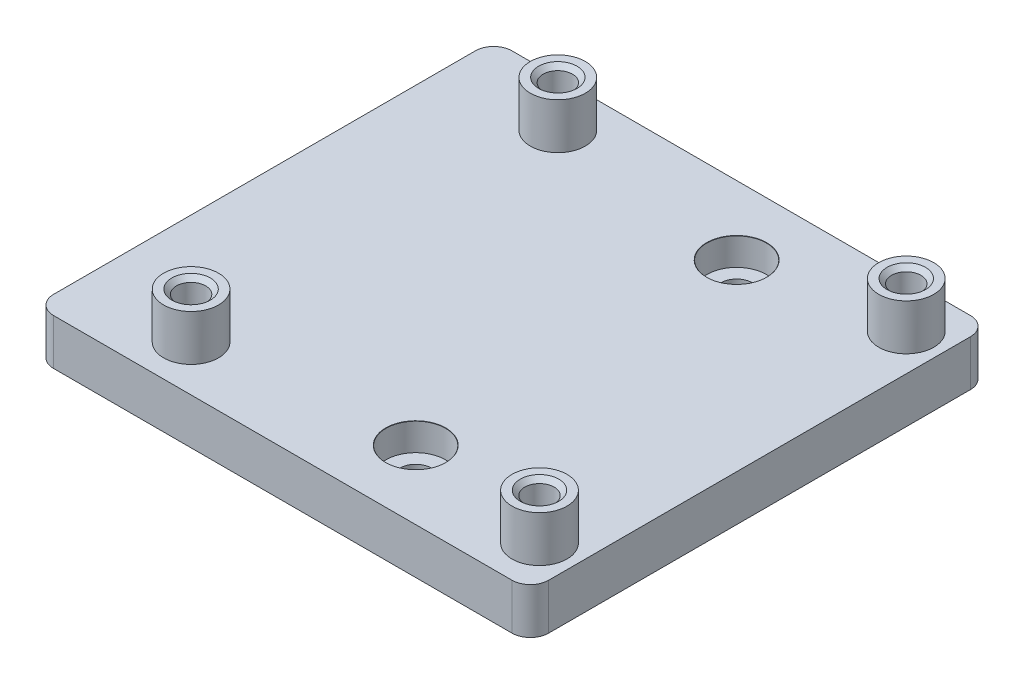
ISO-10303-21;
HEADER;
FILE_DESCRIPTION(('STEP AP214'),'2;1');
FILE_NAME('part.step','',(''),(''),'','','');
FILE_SCHEMA(('AUTOMOTIVE_DESIGN { 1 0 10303 214 1 1 1 1 }'));
ENDSEC;
DATA;
#1=APPLICATION_CONTEXT('core data for automotive mechanical design processes');
#2=APPLICATION_PROTOCOL_DEFINITION('international standard','automotive_design',2000,#1);
#3=PRODUCT_CONTEXT('',#1,'mechanical');
#4=PRODUCT('Part','Part','',(#3));
#5=PRODUCT_RELATED_PRODUCT_CATEGORY('part','',(#4));
#6=PRODUCT_DEFINITION_FORMATION('','',#4);
#7=PRODUCT_DEFINITION_CONTEXT('part definition',#1,'design');
#8=PRODUCT_DEFINITION('design','',#6,#7);
#9=PRODUCT_DEFINITION_SHAPE('','',#8);
#10=(LENGTH_UNIT() NAMED_UNIT(*) SI_UNIT(.MILLI.,.METRE.));
#11=(NAMED_UNIT(*) PLANE_ANGLE_UNIT() SI_UNIT($,.RADIAN.));
#12=(NAMED_UNIT(*) SI_UNIT($,.STERADIAN.) SOLID_ANGLE_UNIT());
#13=UNCERTAINTY_MEASURE_WITH_UNIT(LENGTH_MEASURE(1.E-05),#10,'distance_accuracy_value','');
#14=(GEOMETRIC_REPRESENTATION_CONTEXT(3) GLOBAL_UNCERTAINTY_ASSIGNED_CONTEXT((#13)) GLOBAL_UNIT_ASSIGNED_CONTEXT((#10,
#11,#12)) REPRESENTATION_CONTEXT('',''));
#15=CARTESIAN_POINT('',(0.,0.,0.));
#16=DIRECTION('',(0.,0.,1.));
#17=DIRECTION('',(1.,0.,0.));
#18=AXIS2_PLACEMENT_3D('',#15,#16,#17);
#19=CARTESIAN_POINT('',(0.,5.,0.));
#20=DIRECTION('',(1.,0.,0.));
#21=DIRECTION('',(0.,0.,-1.));
#22=AXIS2_PLACEMENT_3D('',#19,#20,#21);
#23=PLANE('',#22);
#24=DIRECTION('',(0.,0.,1.));
#25=VECTOR('',#24,1.);
#26=CARTESIAN_POINT('',(0.,5.,0.));
#27=LINE('',#26,#25);
#28=CARTESIAN_POINT('',(0.,5.,-48.));
#29=VERTEX_POINT('',#28);
#30=CARTESIAN_POINT('',(0.,5.,-2.));
#31=VERTEX_POINT('',#30);
#32=EDGE_CURVE('E133',#29,#31,#27,.T.);
#33=ORIENTED_EDGE('',*,*,#32,.F.);
#34=DIRECTION('',(0.,-1.,0.));
#35=VECTOR('',#34,1.);
#36=CARTESIAN_POINT('',(0.,5.,-48.));
#37=LINE('',#36,#35);
#38=CARTESIAN_POINT('',(0.,0.,-48.));
#39=VERTEX_POINT('',#38);
#40=EDGE_CURVE('E117',#29,#39,#37,.T.);
#41=ORIENTED_EDGE('',*,*,#40,.T.);
#42=DIRECTION('',(0.,0.,1.));
#43=VECTOR('',#42,1.);
#44=CARTESIAN_POINT('',(0.,0.,0.));
#45=LINE('',#44,#43);
#46=CARTESIAN_POINT('',(0.,0.,-2.));
#47=VERTEX_POINT('',#46);
#48=EDGE_CURVE('E130',#39,#47,#45,.T.);
#49=ORIENTED_EDGE('',*,*,#48,.T.);
#50=DIRECTION('',(0.,-1.,0.));
#51=VECTOR('',#50,1.);
#52=CARTESIAN_POINT('',(0.,5.,-2.));
#53=LINE('',#52,#51);
#54=EDGE_CURVE('E136',#47,#31,#53,.F.);
#55=ORIENTED_EDGE('',*,*,#54,.T.);
#56=EDGE_LOOP('',(#33,#41,#49,#55));
#57=FACE_BOUND('',#56,.T.);
#58=ADVANCED_FACE('F46',(#57),#23,.F.);
#59=CARTESIAN_POINT('',(0.,5.,0.));
#60=DIRECTION('',(0.,0.,-1.));
#61=DIRECTION('',(-1.,0.,0.));
#62=AXIS2_PLACEMENT_3D('',#59,#60,#61);
#63=PLANE('',#62);
#64=DIRECTION('',(1.,0.,0.));
#65=VECTOR('',#64,1.);
#66=CARTESIAN_POINT('',(0.,0.,0.));
#67=LINE('',#66,#65);
#68=CARTESIAN_POINT('',(2.,0.,0.));
#69=VERTEX_POINT('',#68);
#70=CARTESIAN_POINT('',(52.,0.,0.));
#71=VERTEX_POINT('',#70);
#72=EDGE_CURVE('E141',#69,#71,#67,.T.);
#73=ORIENTED_EDGE('',*,*,#72,.T.);
#74=DIRECTION('',(0.,-1.,0.));
#75=VECTOR('',#74,1.);
#76=CARTESIAN_POINT('',(52.,5.,0.));
#77=LINE('',#76,#75);
#78=CARTESIAN_POINT('',(52.,5.,0.));
#79=VERTEX_POINT('',#78);
#80=EDGE_CURVE('E11',#71,#79,#77,.F.);
#81=ORIENTED_EDGE('',*,*,#80,.T.);
#82=DIRECTION('',(1.,0.,0.));
#83=VECTOR('',#82,1.);
#84=CARTESIAN_POINT('',(0.,5.,0.));
#85=LINE('',#84,#83);
#86=CARTESIAN_POINT('',(2.,5.,0.));
#87=VERTEX_POINT('',#86);
#88=EDGE_CURVE('E246',#87,#79,#85,.T.);
#89=ORIENTED_EDGE('',*,*,#88,.F.);
#90=DIRECTION('',(0.,-1.,0.));
#91=VECTOR('',#90,1.);
#92=CARTESIAN_POINT('',(2.,5.,0.));
#93=LINE('',#92,#91);
#94=EDGE_CURVE('E55',#87,#69,#93,.T.);
#95=ORIENTED_EDGE('',*,*,#94,.T.);
#96=EDGE_LOOP('',(#73,#81,#89,#95));
#97=FACE_BOUND('',#96,.T.);
#98=ADVANCED_FACE('F244',(#97),#63,.F.);
#99=CARTESIAN_POINT('',(54.,5.,0.));
#100=DIRECTION('',(-1.,0.,0.));
#101=DIRECTION('',(0.,0.,1.));
#102=AXIS2_PLACEMENT_3D('',#99,#100,#101);
#103=PLANE('',#102);
#104=DIRECTION('',(0.,0.,-1.));
#105=VECTOR('',#104,1.);
#106=CARTESIAN_POINT('',(54.,0.,0.));
#107=LINE('',#106,#105);
#108=CARTESIAN_POINT('',(54.,0.,-2.));
#109=VERTEX_POINT('',#108);
#110=CARTESIAN_POINT('',(54.,0.,-48.));
#111=VERTEX_POINT('',#110);
#112=EDGE_CURVE('E147',#109,#111,#107,.T.);
#113=ORIENTED_EDGE('',*,*,#112,.T.);
#114=DIRECTION('',(0.,-1.,0.));
#115=VECTOR('',#114,1.);
#116=CARTESIAN_POINT('',(54.,5.,-48.));
#117=LINE('',#116,#115);
#118=CARTESIAN_POINT('',(54.,5.,-48.));
#119=VERTEX_POINT('',#118);
#120=EDGE_CURVE('E62',#111,#119,#117,.F.);
#121=ORIENTED_EDGE('',*,*,#120,.T.);
#122=DIRECTION('',(0.,0.,-1.));
#123=VECTOR('',#122,1.);
#124=CARTESIAN_POINT('',(54.,5.,0.));
#125=LINE('',#124,#123);
#126=CARTESIAN_POINT('',(54.,5.,-2.));
#127=VERTEX_POINT('',#126);
#128=EDGE_CURVE('E254',#127,#119,#125,.T.);
#129=ORIENTED_EDGE('',*,*,#128,.F.);
#130=DIRECTION('',(0.,-1.,0.));
#131=VECTOR('',#130,1.);
#132=CARTESIAN_POINT('',(54.,5.,-2.));
#133=LINE('',#132,#131);
#134=EDGE_CURVE('E234',#127,#109,#133,.T.);
#135=ORIENTED_EDGE('',*,*,#134,.T.);
#136=EDGE_LOOP('',(#113,#121,#129,#135));
#137=FACE_BOUND('',#136,.T.);
#138=ADVANCED_FACE('F253',(#137),#103,.F.);
#139=CARTESIAN_POINT('',(0.,5.,-50.));
#140=DIRECTION('',(0.,0.,1.));
#141=DIRECTION('',(1.,0.,0.));
#142=AXIS2_PLACEMENT_3D('',#139,#140,#141);
#143=PLANE('',#142);
#144=DIRECTION('',(-1.,0.,0.));
#145=VECTOR('',#144,1.);
#146=CARTESIAN_POINT('',(0.,0.,-50.));
#147=LINE('',#146,#145);
#148=CARTESIAN_POINT('',(52.,0.,-50.));
#149=VERTEX_POINT('',#148);
#150=CARTESIAN_POINT('',(2.,0.,-50.));
#151=VERTEX_POINT('',#150);
#152=EDGE_CURVE('E158',#149,#151,#147,.T.);
#153=ORIENTED_EDGE('',*,*,#152,.T.);
#154=DIRECTION('',(0.,-1.,0.));
#155=VECTOR('',#154,1.);
#156=CARTESIAN_POINT('',(2.,5.,-50.));
#157=LINE('',#156,#155);
#158=CARTESIAN_POINT('',(2.,5.,-50.));
#159=VERTEX_POINT('',#158);
#160=EDGE_CURVE('E118',#151,#159,#157,.F.);
#161=ORIENTED_EDGE('',*,*,#160,.T.);
#162=DIRECTION('',(-1.,0.,0.));
#163=VECTOR('',#162,1.);
#164=CARTESIAN_POINT('',(0.,5.,-50.));
#165=LINE('',#164,#163);
#166=CARTESIAN_POINT('',(52.,5.,-50.));
#167=VERTEX_POINT('',#166);
#168=EDGE_CURVE('E153',#167,#159,#165,.T.);
#169=ORIENTED_EDGE('',*,*,#168,.F.);
#170=DIRECTION('',(0.,-1.,0.));
#171=VECTOR('',#170,1.);
#172=CARTESIAN_POINT('',(52.,5.,-50.));
#173=LINE('',#172,#171);
#174=EDGE_CURVE('E124',#167,#149,#173,.T.);
#175=ORIENTED_EDGE('',*,*,#174,.T.);
#176=EDGE_LOOP('',(#153,#161,#169,#175));
#177=FACE_BOUND('',#176,.T.);
#178=ADVANCED_FACE('F337',(#177),#143,.F.);
#179=CARTESIAN_POINT('',(0.,5.,0.));
#180=DIRECTION('',(0.,-1.,0.));
#181=DIRECTION('',(0.,0.,-1.));
#182=AXIS2_PLACEMENT_3D('',#179,#180,#181);
#183=PLANE('',#182);
#184=CARTESIAN_POINT('',(34.,5.,-42.5));
#185=DIRECTION('',(0.,1.,0.));
#186=DIRECTION('',(0.,0.,1.));
#187=AXIS2_PLACEMENT_3D('',#184,#185,#186);
#188=CIRCLE('',#187,3.275);
#189=CARTESIAN_POINT('',(34.,5.,-39.225));
#190=VERTEX_POINT('',#189);
#191=EDGE_CURVE('E327',#190,#190,#188,.T.);
#192=ORIENTED_EDGE('',*,*,#191,.F.);
#193=EDGE_LOOP('',(#192));
#194=FACE_BOUND('',#193,.T.);
#195=CARTESIAN_POINT('',(34.,5.,-7.5));
#196=DIRECTION('',(0.,1.,0.));
#197=DIRECTION('',(0.,0.,1.));
#198=AXIS2_PLACEMENT_3D('',#195,#196,#197);
#199=CIRCLE('',#198,3.275);
#200=CARTESIAN_POINT('',(34.,5.,-4.225));
#201=VERTEX_POINT('',#200);
#202=EDGE_CURVE('E307',#201,#201,#199,.T.);
#203=ORIENTED_EDGE('',*,*,#202,.F.);
#204=EDGE_LOOP('',(#203));
#205=FACE_BOUND('',#204,.T.);
#206=CARTESIAN_POINT('',(12.,5.,-5.));
#207=DIRECTION('',(0.,-1.,0.));
#208=DIRECTION('',(0.,0.,-1.));
#209=AXIS2_PLACEMENT_3D('',#206,#207,#208);
#210=CIRCLE('',#209,3.);
#211=CARTESIAN_POINT('',(12.,5.,-8.));
#212=VERTEX_POINT('',#211);
#213=EDGE_CURVE('E173',#212,#212,#210,.F.);
#214=ORIENTED_EDGE('',*,*,#213,.F.);
#215=EDGE_LOOP('',(#214));
#216=FACE_BOUND('',#215,.T.);
#217=CARTESIAN_POINT('',(12.,5.,-45.));
#218=DIRECTION('',(0.,-1.,0.));
#219=DIRECTION('',(0.,0.,-1.));
#220=AXIS2_PLACEMENT_3D('',#217,#218,#219);
#221=CIRCLE('',#220,3.);
#222=CARTESIAN_POINT('',(12.,5.,-48.));
#223=VERTEX_POINT('',#222);
#224=EDGE_CURVE('E169',#223,#223,#221,.F.);
#225=ORIENTED_EDGE('',*,*,#224,.F.);
#226=EDGE_LOOP('',(#225));
#227=FACE_BOUND('',#226,.T.);
#228=CARTESIAN_POINT('',(50.,5.,-45.));
#229=DIRECTION('',(0.,-1.,0.));
#230=DIRECTION('',(0.,0.,-1.));
#231=AXIS2_PLACEMENT_3D('',#228,#229,#230);
#232=CIRCLE('',#231,3.);
#233=CARTESIAN_POINT('',(50.,5.,-48.));
#234=VERTEX_POINT('',#233);
#235=EDGE_CURVE('E165',#234,#234,#232,.F.);
#236=ORIENTED_EDGE('',*,*,#235,.F.);
#237=EDGE_LOOP('',(#236));
#238=FACE_BOUND('',#237,.T.);
#239=CARTESIAN_POINT('',(50.,5.,-5.));
#240=DIRECTION('',(0.,-1.,0.));
#241=DIRECTION('',(0.,0.,-1.));
#242=AXIS2_PLACEMENT_3D('',#239,#240,#241);
#243=CIRCLE('',#242,3.);
#244=CARTESIAN_POINT('',(50.,5.,-8.));
#245=VERTEX_POINT('',#244);
#246=EDGE_CURVE('E161',#245,#245,#243,.F.);
#247=ORIENTED_EDGE('',*,*,#246,.F.);
#248=EDGE_LOOP('',(#247));
#249=FACE_BOUND('',#248,.T.);
#250=ORIENTED_EDGE('',*,*,#168,.T.);
#251=CARTESIAN_POINT('',(2.,5.,-48.));
#252=DIRECTION('',(0.,-1.,0.));
#253=DIRECTION('',(0.,0.,-1.));
#254=AXIS2_PLACEMENT_3D('',#251,#252,#253);
#255=CIRCLE('',#254,2.);
#256=EDGE_CURVE('E231',#159,#29,#255,.F.);
#257=ORIENTED_EDGE('',*,*,#256,.T.);
#258=ORIENTED_EDGE('',*,*,#32,.T.);
#259=CARTESIAN_POINT('',(2.,5.,-2.));
#260=DIRECTION('',(0.,-1.,0.));
#261=DIRECTION('',(0.,0.,-1.));
#262=AXIS2_PLACEMENT_3D('',#259,#260,#261);
#263=CIRCLE('',#262,2.);
#264=EDGE_CURVE('E223',#31,#87,#263,.F.);
#265=ORIENTED_EDGE('',*,*,#264,.T.);
#266=ORIENTED_EDGE('',*,*,#88,.T.);
#267=CARTESIAN_POINT('',(52.,5.,-2.));
#268=DIRECTION('',(0.,-1.,0.));
#269=DIRECTION('',(0.,0.,-1.));
#270=AXIS2_PLACEMENT_3D('',#267,#268,#269);
#271=CIRCLE('',#270,2.);
#272=EDGE_CURVE('E69',#79,#127,#271,.F.);
#273=ORIENTED_EDGE('',*,*,#272,.T.);
#274=ORIENTED_EDGE('',*,*,#128,.T.);
#275=CARTESIAN_POINT('',(52.,5.,-48.));
#276=DIRECTION('',(0.,-1.,0.));
#277=DIRECTION('',(0.,0.,-1.));
#278=AXIS2_PLACEMENT_3D('',#275,#276,#277);
#279=CIRCLE('',#278,2.);
#280=EDGE_CURVE('E228',#119,#167,#279,.F.);
#281=ORIENTED_EDGE('',*,*,#280,.T.);
#282=EDGE_LOOP('',(#250,#257,#258,#265,#266,#273,#274,#281));
#283=FACE_BOUND('',#282,.T.);
#284=ADVANCED_FACE('F334',(#194,#205,#216,#227,#238,#249,#283),#183,.F.);
#285=CARTESIAN_POINT('',(0.,0.,0.));
#286=DIRECTION('',(0.,-1.,0.));
#287=DIRECTION('',(0.,0.,-1.));
#288=AXIS2_PLACEMENT_3D('',#285,#286,#287);
#289=PLANE('',#288);
#290=CARTESIAN_POINT('',(34.,0.,-42.5));
#291=DIRECTION('',(0.,1.,0.));
#292=DIRECTION('',(0.,0.,1.));
#293=AXIS2_PLACEMENT_3D('',#290,#291,#292);
#294=CIRCLE('',#293,1.7);
#295=CARTESIAN_POINT('',(34.,0.,-40.8));
#296=VERTEX_POINT('',#295);
#297=EDGE_CURVE('E311',#296,#296,#294,.T.);
#298=ORIENTED_EDGE('',*,*,#297,.T.);
#299=EDGE_LOOP('',(#298));
#300=FACE_BOUND('',#299,.T.);
#301=CARTESIAN_POINT('',(34.,0.,-7.5));
#302=DIRECTION('',(0.,1.,0.));
#303=DIRECTION('',(0.,0.,1.));
#304=AXIS2_PLACEMENT_3D('',#301,#302,#303);
#305=CIRCLE('',#304,1.7);
#306=CARTESIAN_POINT('',(34.,0.,-5.8));
#307=VERTEX_POINT('',#306);
#308=EDGE_CURVE('E277',#307,#307,#305,.T.);
#309=ORIENTED_EDGE('',*,*,#308,.T.);
#310=EDGE_LOOP('',(#309));
#311=FACE_BOUND('',#310,.T.);
#312=ORIENTED_EDGE('',*,*,#48,.F.);
#313=CARTESIAN_POINT('',(2.,0.,-48.));
#314=DIRECTION('',(0.,-1.,0.));
#315=DIRECTION('',(0.,0.,-1.));
#316=AXIS2_PLACEMENT_3D('',#313,#314,#315);
#317=CIRCLE('',#316,2.);
#318=EDGE_CURVE('E113',#39,#151,#317,.T.);
#319=ORIENTED_EDGE('',*,*,#318,.T.);
#320=ORIENTED_EDGE('',*,*,#152,.F.);
#321=CARTESIAN_POINT('',(52.,0.,-48.));
#322=DIRECTION('',(0.,-1.,0.));
#323=DIRECTION('',(0.,0.,-1.));
#324=AXIS2_PLACEMENT_3D('',#321,#322,#323);
#325=CIRCLE('',#324,2.);
#326=EDGE_CURVE('E125',#149,#111,#325,.T.);
#327=ORIENTED_EDGE('',*,*,#326,.T.);
#328=ORIENTED_EDGE('',*,*,#112,.F.);
#329=CARTESIAN_POINT('',(52.,0.,-2.));
#330=DIRECTION('',(0.,-1.,0.));
#331=DIRECTION('',(0.,0.,-1.));
#332=AXIS2_PLACEMENT_3D('',#329,#330,#331);
#333=CIRCLE('',#332,2.);
#334=EDGE_CURVE('E213',#109,#71,#333,.T.);
#335=ORIENTED_EDGE('',*,*,#334,.T.);
#336=ORIENTED_EDGE('',*,*,#72,.F.);
#337=CARTESIAN_POINT('',(2.,0.,-2.));
#338=DIRECTION('',(0.,-1.,0.));
#339=DIRECTION('',(0.,0.,-1.));
#340=AXIS2_PLACEMENT_3D('',#337,#338,#339);
#341=CIRCLE('',#340,2.);
#342=EDGE_CURVE('E135',#69,#47,#341,.T.);
#343=ORIENTED_EDGE('',*,*,#342,.T.);
#344=EDGE_LOOP('',(#312,#319,#320,#327,#328,#335,#336,#343));
#345=FACE_BOUND('',#344,.T.);
#346=ADVANCED_FACE('F138',(#300,#311,#345),#289,.T.);
#347=CARTESIAN_POINT('',(50.,10.,-5.));
#348=DIRECTION('',(0.,1.,0.));
#349=DIRECTION('',(0.,0.,1.));
#350=AXIS2_PLACEMENT_3D('',#347,#348,#349);
#351=PLANE('',#350);
#352=CARTESIAN_POINT('',(50.,10.,-5.));
#353=DIRECTION('',(0.,1.,0.));
#354=DIRECTION('',(0.,0.,1.));
#355=AXIS2_PLACEMENT_3D('',#352,#353,#354);
#356=CIRCLE('',#355,2.1);
#357=CARTESIAN_POINT('',(50.,10.,-2.9));
#358=VERTEX_POINT('',#357);
#359=EDGE_CURVE('E189',#358,#358,#356,.F.);
#360=ORIENTED_EDGE('',*,*,#359,.T.);
#361=EDGE_LOOP('',(#360));
#362=FACE_BOUND('',#361,.T.);
#363=CARTESIAN_POINT('',(50.,10.,-5.));
#364=DIRECTION('',(0.,1.,0.));
#365=DIRECTION('',(0.,0.,1.));
#366=AXIS2_PLACEMENT_3D('',#363,#364,#365);
#367=CIRCLE('',#366,3.);
#368=CARTESIAN_POINT('',(50.,10.,-2.));
#369=VERTEX_POINT('',#368);
#370=EDGE_CURVE('E142',#369,#369,#367,.T.);
#371=ORIENTED_EDGE('',*,*,#370,.T.);
#372=EDGE_LOOP('',(#371));
#373=FACE_BOUND('',#372,.T.);
#374=ADVANCED_FACE('F427',(#362,#373),#351,.T.);
#375=CARTESIAN_POINT('',(50.,10.,-5.));
#376=DIRECTION('',(0.,-1.,0.));
#377=DIRECTION('',(0.,0.,-1.));
#378=AXIS2_PLACEMENT_3D('',#375,#376,#377);
#379=CYLINDRICAL_SURFACE('',#378,3.);
#380=ORIENTED_EDGE('',*,*,#370,.F.);
#381=EDGE_LOOP('',(#380));
#382=FACE_BOUND('',#381,.T.);
#383=ORIENTED_EDGE('',*,*,#246,.T.);
#384=EDGE_LOOP('',(#383));
#385=FACE_BOUND('',#384,.T.);
#386=ADVANCED_FACE('F423',(#382,#385),#379,.T.);
#387=CARTESIAN_POINT('',(50.,10.,-5.));
#388=DIRECTION('',(0.,-1.,0.));
#389=DIRECTION('',(0.,0.,-1.));
#390=AXIS2_PLACEMENT_3D('',#387,#388,#389);
#391=CYLINDRICAL_SURFACE('',#390,1.6);
#392=CARTESIAN_POINT('',(50.,9.49999999999999,-5.));
#393=DIRECTION('',(0.,1.,0.));
#394=DIRECTION('',(0.,0.,1.));
#395=AXIS2_PLACEMENT_3D('',#392,#393,#394);
#396=CIRCLE('',#395,1.6);
#397=CARTESIAN_POINT('',(50.,9.49999999999999,-3.4));
#398=VERTEX_POINT('',#397);
#399=EDGE_CURVE('E185',#398,#398,#396,.T.);
#400=ORIENTED_EDGE('',*,*,#399,.T.);
#401=EDGE_LOOP('',(#400));
#402=FACE_BOUND('',#401,.T.);
#403=CARTESIAN_POINT('',(50.,5.,-5.));
#404=DIRECTION('',(0.,1.,0.));
#405=DIRECTION('',(0.,0.,1.));
#406=AXIS2_PLACEMENT_3D('',#403,#404,#405);
#407=CIRCLE('',#406,1.6);
#408=CARTESIAN_POINT('',(50.,5.,-3.4));
#409=VERTEX_POINT('',#408);
#410=EDGE_CURVE('E150',#409,#409,#407,.T.);
#411=ORIENTED_EDGE('',*,*,#410,.F.);
#412=EDGE_LOOP('',(#411));
#413=FACE_BOUND('',#412,.T.);
#414=ADVANCED_FACE('F661',(#402,#413),#391,.F.);
#415=CARTESIAN_POINT('',(50.,10.,-45.));
#416=DIRECTION('',(0.,1.,0.));
#417=DIRECTION('',(0.,0.,1.));
#418=AXIS2_PLACEMENT_3D('',#415,#416,#417);
#419=PLANE('',#418);
#420=CARTESIAN_POINT('',(50.,10.,-45.));
#421=DIRECTION('',(0.,1.,0.));
#422=DIRECTION('',(0.,0.,1.));
#423=AXIS2_PLACEMENT_3D('',#420,#421,#422);
#424=CIRCLE('',#423,2.1);
#425=CARTESIAN_POINT('',(50.,10.,-42.9));
#426=VERTEX_POINT('',#425);
#427=EDGE_CURVE('E197',#426,#426,#424,.F.);
#428=ORIENTED_EDGE('',*,*,#427,.T.);
#429=EDGE_LOOP('',(#428));
#430=FACE_BOUND('',#429,.T.);
#431=CARTESIAN_POINT('',(50.,10.,-45.));
#432=DIRECTION('',(0.,1.,0.));
#433=DIRECTION('',(0.,0.,1.));
#434=AXIS2_PLACEMENT_3D('',#431,#432,#433);
#435=CIRCLE('',#434,3.);
#436=CARTESIAN_POINT('',(50.,10.,-42.));
#437=VERTEX_POINT('',#436);
#438=EDGE_CURVE('E282',#437,#437,#435,.T.);
#439=ORIENTED_EDGE('',*,*,#438,.T.);
#440=EDGE_LOOP('',(#439));
#441=FACE_BOUND('',#440,.T.);
#442=ADVANCED_FACE('F651',(#430,#441),#419,.T.);
#443=CARTESIAN_POINT('',(50.,10.,-45.));
#444=DIRECTION('',(0.,-1.,0.));
#445=DIRECTION('',(0.,0.,-1.));
#446=AXIS2_PLACEMENT_3D('',#443,#444,#445);
#447=CYLINDRICAL_SURFACE('',#446,3.);
#448=ORIENTED_EDGE('',*,*,#438,.F.);
#449=EDGE_LOOP('',(#448));
#450=FACE_BOUND('',#449,.T.);
#451=ORIENTED_EDGE('',*,*,#235,.T.);
#452=EDGE_LOOP('',(#451));
#453=FACE_BOUND('',#452,.T.);
#454=ADVANCED_FACE('F641',(#450,#453),#447,.T.);
#455=CARTESIAN_POINT('',(50.,10.,-45.));
#456=DIRECTION('',(0.,-1.,0.));
#457=DIRECTION('',(0.,0.,-1.));
#458=AXIS2_PLACEMENT_3D('',#455,#456,#457);
#459=CYLINDRICAL_SURFACE('',#458,1.6);
#460=CARTESIAN_POINT('',(50.,9.49999999999999,-45.));
#461=DIRECTION('',(0.,1.,0.));
#462=DIRECTION('',(0.,0.,1.));
#463=AXIS2_PLACEMENT_3D('',#460,#461,#462);
#464=CIRCLE('',#463,1.6);
#465=CARTESIAN_POINT('',(50.,9.49999999999999,-43.4));
#466=VERTEX_POINT('',#465);
#467=EDGE_CURVE('E193',#466,#466,#464,.T.);
#468=ORIENTED_EDGE('',*,*,#467,.T.);
#469=EDGE_LOOP('',(#468));
#470=FACE_BOUND('',#469,.T.);
#471=CARTESIAN_POINT('',(50.,5.,-45.));
#472=DIRECTION('',(0.,1.,0.));
#473=DIRECTION('',(0.,0.,1.));
#474=AXIS2_PLACEMENT_3D('',#471,#472,#473);
#475=CIRCLE('',#474,1.6);
#476=CARTESIAN_POINT('',(50.,5.,-43.4));
#477=VERTEX_POINT('',#476);
#478=EDGE_CURVE('E267',#477,#477,#475,.T.);
#479=ORIENTED_EDGE('',*,*,#478,.F.);
#480=EDGE_LOOP('',(#479));
#481=FACE_BOUND('',#480,.T.);
#482=ADVANCED_FACE('F631',(#470,#481),#459,.F.);
#483=CARTESIAN_POINT('',(12.,10.,-45.));
#484=DIRECTION('',(0.,1.,0.));
#485=DIRECTION('',(0.,0.,1.));
#486=AXIS2_PLACEMENT_3D('',#483,#484,#485);
#487=PLANE('',#486);
#488=CARTESIAN_POINT('',(12.,10.,-45.));
#489=DIRECTION('',(0.,1.,0.));
#490=DIRECTION('',(0.,0.,1.));
#491=AXIS2_PLACEMENT_3D('',#488,#489,#490);
#492=CIRCLE('',#491,2.1);
#493=CARTESIAN_POINT('',(12.,10.,-42.9));
#494=VERTEX_POINT('',#493);
#495=EDGE_CURVE('E205',#494,#494,#492,.F.);
#496=ORIENTED_EDGE('',*,*,#495,.T.);
#497=EDGE_LOOP('',(#496));
#498=FACE_BOUND('',#497,.T.);
#499=CARTESIAN_POINT('',(12.,10.,-45.));
#500=DIRECTION('',(0.,1.,0.));
#501=DIRECTION('',(0.,0.,1.));
#502=AXIS2_PLACEMENT_3D('',#499,#500,#501);
#503=CIRCLE('',#502,3.);
#504=CARTESIAN_POINT('',(12.,10.,-42.));
#505=VERTEX_POINT('',#504);
#506=EDGE_CURVE('E272',#505,#505,#503,.T.);
#507=ORIENTED_EDGE('',*,*,#506,.T.);
#508=EDGE_LOOP('',(#507));
#509=FACE_BOUND('',#508,.T.);
#510=ADVANCED_FACE('F621',(#498,#509),#487,.T.);
#511=CARTESIAN_POINT('',(12.,10.,-45.));
#512=DIRECTION('',(0.,-1.,0.));
#513=DIRECTION('',(0.,0.,-1.));
#514=AXIS2_PLACEMENT_3D('',#511,#512,#513);
#515=CYLINDRICAL_SURFACE('',#514,3.);
#516=ORIENTED_EDGE('',*,*,#506,.F.);
#517=EDGE_LOOP('',(#516));
#518=FACE_BOUND('',#517,.T.);
#519=ORIENTED_EDGE('',*,*,#224,.T.);
#520=EDGE_LOOP('',(#519));
#521=FACE_BOUND('',#520,.T.);
#522=ADVANCED_FACE('F407',(#518,#521),#515,.T.);
#523=CARTESIAN_POINT('',(12.,10.,-45.));
#524=DIRECTION('',(0.,-1.,0.));
#525=DIRECTION('',(0.,0.,-1.));
#526=AXIS2_PLACEMENT_3D('',#523,#524,#525);
#527=CYLINDRICAL_SURFACE('',#526,1.6);
#528=CARTESIAN_POINT('',(12.,9.5,-45.));
#529=DIRECTION('',(0.,1.,0.));
#530=DIRECTION('',(0.,0.,1.));
#531=AXIS2_PLACEMENT_3D('',#528,#529,#530);
#532=CIRCLE('',#531,1.6);
#533=CARTESIAN_POINT('',(12.,9.5,-43.4));
#534=VERTEX_POINT('',#533);
#535=EDGE_CURVE('E201',#534,#534,#532,.T.);
#536=ORIENTED_EDGE('',*,*,#535,.T.);
#537=EDGE_LOOP('',(#536));
#538=FACE_BOUND('',#537,.T.);
#539=CARTESIAN_POINT('',(12.,5.,-45.));
#540=DIRECTION('',(0.,1.,0.));
#541=DIRECTION('',(0.,0.,1.));
#542=AXIS2_PLACEMENT_3D('',#539,#540,#541);
#543=CIRCLE('',#542,1.6);
#544=CARTESIAN_POINT('',(12.,5.,-43.4));
#545=VERTEX_POINT('',#544);
#546=EDGE_CURVE('E278',#545,#545,#543,.T.);
#547=ORIENTED_EDGE('',*,*,#546,.F.);
#548=EDGE_LOOP('',(#547));
#549=FACE_BOUND('',#548,.T.);
#550=ADVANCED_FACE('F403',(#538,#549),#527,.F.);
#551=CARTESIAN_POINT('',(12.,10.,-5.));
#552=DIRECTION('',(0.,1.,0.));
#553=DIRECTION('',(0.,0.,1.));
#554=AXIS2_PLACEMENT_3D('',#551,#552,#553);
#555=PLANE('',#554);
#556=CARTESIAN_POINT('',(12.,10.,-5.));
#557=DIRECTION('',(0.,1.,0.));
#558=DIRECTION('',(0.,0.,1.));
#559=AXIS2_PLACEMENT_3D('',#556,#557,#558);
#560=CIRCLE('',#559,2.1);
#561=CARTESIAN_POINT('',(12.,10.,-2.9));
#562=VERTEX_POINT('',#561);
#563=EDGE_CURVE('E181',#562,#562,#560,.F.);
#564=ORIENTED_EDGE('',*,*,#563,.T.);
#565=EDGE_LOOP('',(#564));
#566=FACE_BOUND('',#565,.T.);
#567=CARTESIAN_POINT('',(12.,10.,-5.));
#568=DIRECTION('',(0.,1.,0.));
#569=DIRECTION('',(0.,0.,1.));
#570=AXIS2_PLACEMENT_3D('',#567,#568,#569);
#571=CIRCLE('',#570,3.);
#572=CARTESIAN_POINT('',(12.,10.,-2.));
#573=VERTEX_POINT('',#572);
#574=EDGE_CURVE('E273',#573,#573,#571,.T.);
#575=ORIENTED_EDGE('',*,*,#574,.T.);
#576=EDGE_LOOP('',(#575));
#577=FACE_BOUND('',#576,.T.);
#578=ADVANCED_FACE('F406',(#566,#577),#555,.T.);
#579=CARTESIAN_POINT('',(12.,10.,-5.));
#580=DIRECTION('',(0.,-1.,0.));
#581=DIRECTION('',(0.,0.,-1.));
#582=AXIS2_PLACEMENT_3D('',#579,#580,#581);
#583=CYLINDRICAL_SURFACE('',#582,3.);
#584=ORIENTED_EDGE('',*,*,#574,.F.);
#585=EDGE_LOOP('',(#584));
#586=FACE_BOUND('',#585,.T.);
#587=ORIENTED_EDGE('',*,*,#213,.T.);
#588=EDGE_LOOP('',(#587));
#589=FACE_BOUND('',#588,.T.);
#590=ADVANCED_FACE('F585',(#586,#589),#583,.T.);
#591=CARTESIAN_POINT('',(12.,10.,-5.));
#592=DIRECTION('',(0.,-1.,0.));
#593=DIRECTION('',(0.,0.,-1.));
#594=AXIS2_PLACEMENT_3D('',#591,#592,#593);
#595=CYLINDRICAL_SURFACE('',#594,1.6);
#596=CARTESIAN_POINT('',(12.,9.5,-5.));
#597=DIRECTION('',(0.,1.,0.));
#598=DIRECTION('',(0.,0.,1.));
#599=AXIS2_PLACEMENT_3D('',#596,#597,#598);
#600=CIRCLE('',#599,1.6);
#601=CARTESIAN_POINT('',(12.,9.5,-3.4));
#602=VERTEX_POINT('',#601);
#603=EDGE_CURVE('E177',#602,#602,#600,.T.);
#604=ORIENTED_EDGE('',*,*,#603,.T.);
#605=EDGE_LOOP('',(#604));
#606=FACE_BOUND('',#605,.T.);
#607=CARTESIAN_POINT('',(12.,5.,-5.));
#608=DIRECTION('',(0.,1.,0.));
#609=DIRECTION('',(0.,0.,1.));
#610=AXIS2_PLACEMENT_3D('',#607,#608,#609);
#611=CIRCLE('',#610,1.6);
#612=CARTESIAN_POINT('',(12.,5.,-3.4));
#613=VERTEX_POINT('',#612);
#614=EDGE_CURVE('E268',#613,#613,#611,.T.);
#615=ORIENTED_EDGE('',*,*,#614,.F.);
#616=EDGE_LOOP('',(#615));
#617=FACE_BOUND('',#616,.T.);
#618=ADVANCED_FACE('F581',(#606,#617),#595,.F.);
#619=ORIENTED_EDGE('',*,*,#410,.T.);
#620=EDGE_LOOP('',(#619));
#621=FACE_BOUND('',#620,.T.);
#622=ADVANCED_FACE('F340',(#621),#183,.F.);
#623=ORIENTED_EDGE('',*,*,#478,.T.);
#624=EDGE_LOOP('',(#623));
#625=FACE_BOUND('',#624,.T.);
#626=ADVANCED_FACE('F413',(#625),#183,.F.);
#627=ORIENTED_EDGE('',*,*,#546,.T.);
#628=EDGE_LOOP('',(#627));
#629=FACE_BOUND('',#628,.T.);
#630=ADVANCED_FACE('F411',(#629),#183,.F.);
#631=ORIENTED_EDGE('',*,*,#614,.T.);
#632=EDGE_LOOP('',(#631));
#633=FACE_BOUND('',#632,.T.);
#634=ADVANCED_FACE('F339',(#633),#183,.F.);
#635=CARTESIAN_POINT('',(34.,5.,-7.5));
#636=DIRECTION('',(0.,1.,0.));
#637=DIRECTION('',(0.,0.,1.));
#638=AXIS2_PLACEMENT_3D('',#635,#636,#637);
#639=CYLINDRICAL_SURFACE('',#638,1.7);
#640=ORIENTED_EDGE('',*,*,#308,.F.);
#641=EDGE_LOOP('',(#640));
#642=FACE_BOUND('',#641,.T.);
#643=CARTESIAN_POINT('',(34.,2.,-7.5));
#644=DIRECTION('',(0.,1.,0.));
#645=DIRECTION('',(0.,0.,1.));
#646=AXIS2_PLACEMENT_3D('',#643,#644,#645);
#647=CIRCLE('',#646,1.7);
#648=CARTESIAN_POINT('',(34.,2.,-5.8));
#649=VERTEX_POINT('',#648);
#650=EDGE_CURVE('E295',#649,#649,#647,.T.);
#651=ORIENTED_EDGE('',*,*,#650,.T.);
#652=EDGE_LOOP('',(#651));
#653=FACE_BOUND('',#652,.T.);
#654=ADVANCED_FACE('F418',(#642,#653),#639,.F.);
#655=CARTESIAN_POINT('',(37.25,2.,-7.5));
#656=DIRECTION('',(0.,-1.,0.));
#657=DIRECTION('',(0.,0.,-1.));
#658=AXIS2_PLACEMENT_3D('',#655,#656,#657);
#659=PLANE('',#658);
#660=ORIENTED_EDGE('',*,*,#650,.F.);
#661=EDGE_LOOP('',(#660));
#662=FACE_BOUND('',#661,.T.);
#663=CARTESIAN_POINT('',(34.,2.,-7.5));
#664=DIRECTION('',(0.,1.,0.));
#665=DIRECTION('',(0.,0.,1.));
#666=AXIS2_PLACEMENT_3D('',#663,#664,#665);
#667=CIRCLE('',#666,3.25);
#668=CARTESIAN_POINT('',(34.,2.,-4.25));
#669=VERTEX_POINT('',#668);
#670=EDGE_CURVE('E299',#669,#669,#667,.T.);
#671=ORIENTED_EDGE('',*,*,#670,.T.);
#672=EDGE_LOOP('',(#671));
#673=FACE_BOUND('',#672,.T.);
#674=ADVANCED_FACE('F557',(#662,#673),#659,.F.);
#675=CARTESIAN_POINT('',(34.,5.,-7.5));
#676=DIRECTION('',(0.,1.,0.));
#677=DIRECTION('',(0.,0.,1.));
#678=AXIS2_PLACEMENT_3D('',#675,#676,#677);
#679=CYLINDRICAL_SURFACE('',#678,3.25);
#680=ORIENTED_EDGE('',*,*,#670,.F.);
#681=EDGE_LOOP('',(#680));
#682=FACE_BOUND('',#681,.T.);
#683=CARTESIAN_POINT('',(34.,4.975,-7.5));
#684=DIRECTION('',(0.,1.,0.));
#685=DIRECTION('',(0.,0.,1.));
#686=AXIS2_PLACEMENT_3D('',#683,#684,#685);
#687=CIRCLE('',#686,3.25);
#688=CARTESIAN_POINT('',(34.,4.975,-4.24999999999999));
#689=VERTEX_POINT('',#688);
#690=EDGE_CURVE('E303',#689,#689,#687,.T.);
#691=ORIENTED_EDGE('',*,*,#690,.T.);
#692=EDGE_LOOP('',(#691));
#693=FACE_BOUND('',#692,.T.);
#694=ADVANCED_FACE('F547',(#682,#693),#679,.F.);
#695=CARTESIAN_POINT('',(34.,5.,-7.5));
#696=DIRECTION('',(0.,1.,0.));
#697=DIRECTION('',(0.,0.,1.));
#698=AXIS2_PLACEMENT_3D('',#695,#696,#697);
#699=CONICAL_SURFACE('',#698,3.275,0.785398163397327);
#700=ORIENTED_EDGE('',*,*,#690,.F.);
#701=EDGE_LOOP('',(#700));
#702=FACE_BOUND('',#701,.T.);
#703=ORIENTED_EDGE('',*,*,#202,.T.);
#704=EDGE_LOOP('',(#703));
#705=FACE_BOUND('',#704,.T.);
#706=ADVANCED_FACE('F537',(#702,#705),#699,.F.);
#707=CARTESIAN_POINT('',(34.,5.,-42.5));
#708=DIRECTION('',(0.,1.,0.));
#709=DIRECTION('',(0.,0.,1.));
#710=AXIS2_PLACEMENT_3D('',#707,#708,#709);
#711=CYLINDRICAL_SURFACE('',#710,1.7);
#712=ORIENTED_EDGE('',*,*,#297,.F.);
#713=EDGE_LOOP('',(#712));
#714=FACE_BOUND('',#713,.T.);
#715=CARTESIAN_POINT('',(34.,2.,-42.5));
#716=DIRECTION('',(0.,1.,0.));
#717=DIRECTION('',(0.,0.,1.));
#718=AXIS2_PLACEMENT_3D('',#715,#716,#717);
#719=CIRCLE('',#718,1.7);
#720=CARTESIAN_POINT('',(34.,2.,-40.8));
#721=VERTEX_POINT('',#720);
#722=EDGE_CURVE('E315',#721,#721,#719,.T.);
#723=ORIENTED_EDGE('',*,*,#722,.T.);
#724=EDGE_LOOP('',(#723));
#725=FACE_BOUND('',#724,.T.);
#726=ADVANCED_FACE('F527',(#714,#725),#711,.F.);
#727=CARTESIAN_POINT('',(37.25,2.,-42.5));
#728=DIRECTION('',(0.,-1.,0.));
#729=DIRECTION('',(0.,0.,-1.));
#730=AXIS2_PLACEMENT_3D('',#727,#728,#729);
#731=PLANE('',#730);
#732=ORIENTED_EDGE('',*,*,#722,.F.);
#733=EDGE_LOOP('',(#732));
#734=FACE_BOUND('',#733,.T.);
#735=CARTESIAN_POINT('',(34.,2.,-42.5));
#736=DIRECTION('',(0.,1.,0.));
#737=DIRECTION('',(0.,0.,1.));
#738=AXIS2_PLACEMENT_3D('',#735,#736,#737);
#739=CIRCLE('',#738,3.25);
#740=CARTESIAN_POINT('',(34.,2.,-39.25));
#741=VERTEX_POINT('',#740);
#742=EDGE_CURVE('E319',#741,#741,#739,.T.);
#743=ORIENTED_EDGE('',*,*,#742,.T.);
#744=EDGE_LOOP('',(#743));
#745=FACE_BOUND('',#744,.T.);
#746=ADVANCED_FACE('F517',(#734,#745),#731,.F.);
#747=CARTESIAN_POINT('',(34.,5.,-42.5));
#748=DIRECTION('',(0.,1.,0.));
#749=DIRECTION('',(0.,0.,1.));
#750=AXIS2_PLACEMENT_3D('',#747,#748,#749);
#751=CYLINDRICAL_SURFACE('',#750,3.25);
#752=ORIENTED_EDGE('',*,*,#742,.F.);
#753=EDGE_LOOP('',(#752));
#754=FACE_BOUND('',#753,.T.);
#755=CARTESIAN_POINT('',(34.,4.975,-42.5));
#756=DIRECTION('',(0.,1.,0.));
#757=DIRECTION('',(0.,0.,1.));
#758=AXIS2_PLACEMENT_3D('',#755,#756,#757);
#759=CIRCLE('',#758,3.25);
#760=CARTESIAN_POINT('',(34.,4.975,-39.25));
#761=VERTEX_POINT('',#760);
#762=EDGE_CURVE('E323',#761,#761,#759,.T.);
#763=ORIENTED_EDGE('',*,*,#762,.T.);
#764=EDGE_LOOP('',(#763));
#765=FACE_BOUND('',#764,.T.);
#766=ADVANCED_FACE('F506',(#754,#765),#751,.F.);
#767=CARTESIAN_POINT('',(34.,5.,-42.5));
#768=DIRECTION('',(0.,1.,0.));
#769=DIRECTION('',(0.,0.,1.));
#770=AXIS2_PLACEMENT_3D('',#767,#768,#769);
#771=CONICAL_SURFACE('',#770,3.275,0.785398163397327);
#772=ORIENTED_EDGE('',*,*,#762,.F.);
#773=EDGE_LOOP('',(#772));
#774=FACE_BOUND('',#773,.T.);
#775=ORIENTED_EDGE('',*,*,#191,.T.);
#776=EDGE_LOOP('',(#775));
#777=FACE_BOUND('',#776,.T.);
#778=ADVANCED_FACE('F332',(#774,#777),#771,.F.);
#779=CARTESIAN_POINT('',(12.,9.5,-5.));
#780=DIRECTION('',(0.,1.,0.));
#781=DIRECTION('',(0.,0.,1.));
#782=AXIS2_PLACEMENT_3D('',#779,#780,#781);
#783=CONICAL_SURFACE('',#782,1.6,0.785398163397449);
#784=ORIENTED_EDGE('',*,*,#563,.F.);
#785=EDGE_LOOP('',(#784));
#786=FACE_BOUND('',#785,.T.);
#787=ORIENTED_EDGE('',*,*,#603,.F.);
#788=EDGE_LOOP('',(#787));
#789=FACE_BOUND('',#788,.T.);
#790=ADVANCED_FACE('F373',(#786,#789),#783,.F.);
#791=CARTESIAN_POINT('',(50.,9.49999999999999,-5.));
#792=DIRECTION('',(0.,1.,0.));
#793=DIRECTION('',(0.,0.,1.));
#794=AXIS2_PLACEMENT_3D('',#791,#792,#793);
#795=CONICAL_SURFACE('',#794,1.6,0.785398163397449);
#796=ORIENTED_EDGE('',*,*,#359,.F.);
#797=EDGE_LOOP('',(#796));
#798=FACE_BOUND('',#797,.T.);
#799=ORIENTED_EDGE('',*,*,#399,.F.);
#800=EDGE_LOOP('',(#799));
#801=FACE_BOUND('',#800,.T.);
#802=ADVANCED_FACE('F379',(#798,#801),#795,.F.);
#803=CARTESIAN_POINT('',(50.,9.49999999999999,-45.));
#804=DIRECTION('',(0.,1.,0.));
#805=DIRECTION('',(0.,0.,1.));
#806=AXIS2_PLACEMENT_3D('',#803,#804,#805);
#807=CONICAL_SURFACE('',#806,1.6,0.78539816339745);
#808=ORIENTED_EDGE('',*,*,#427,.F.);
#809=EDGE_LOOP('',(#808));
#810=FACE_BOUND('',#809,.T.);
#811=ORIENTED_EDGE('',*,*,#467,.F.);
#812=EDGE_LOOP('',(#811));
#813=FACE_BOUND('',#812,.T.);
#814=ADVANCED_FACE('F386',(#810,#813),#807,.F.);
#815=CARTESIAN_POINT('',(12.,9.5,-45.));
#816=DIRECTION('',(0.,1.,0.));
#817=DIRECTION('',(0.,0.,1.));
#818=AXIS2_PLACEMENT_3D('',#815,#816,#817);
#819=CONICAL_SURFACE('',#818,1.6,0.78539816339745);
#820=ORIENTED_EDGE('',*,*,#495,.F.);
#821=EDGE_LOOP('',(#820));
#822=FACE_BOUND('',#821,.T.);
#823=ORIENTED_EDGE('',*,*,#535,.F.);
#824=EDGE_LOOP('',(#823));
#825=FACE_BOUND('',#824,.T.);
#826=ADVANCED_FACE('F361',(#822,#825),#819,.F.);
#827=CARTESIAN_POINT('',(2.,5.,-48.));
#828=DIRECTION('',(0.,-1.,0.));
#829=DIRECTION('',(0.,0.,-1.));
#830=AXIS2_PLACEMENT_3D('',#827,#828,#829);
#831=CYLINDRICAL_SURFACE('',#830,2.);
#832=ORIENTED_EDGE('',*,*,#256,.F.);
#833=ORIENTED_EDGE('',*,*,#160,.F.);
#834=ORIENTED_EDGE('',*,*,#318,.F.);
#835=ORIENTED_EDGE('',*,*,#40,.F.);
#836=EDGE_LOOP('',(#832,#833,#834,#835));
#837=FACE_BOUND('',#836,.T.);
#838=ADVANCED_FACE('F116',(#837),#831,.T.);
#839=CARTESIAN_POINT('',(52.,5.,-48.));
#840=DIRECTION('',(0.,-1.,0.));
#841=DIRECTION('',(0.,0.,-1.));
#842=AXIS2_PLACEMENT_3D('',#839,#840,#841);
#843=CYLINDRICAL_SURFACE('',#842,2.);
#844=ORIENTED_EDGE('',*,*,#280,.F.);
#845=ORIENTED_EDGE('',*,*,#120,.F.);
#846=ORIENTED_EDGE('',*,*,#326,.F.);
#847=ORIENTED_EDGE('',*,*,#174,.F.);
#848=EDGE_LOOP('',(#844,#845,#846,#847));
#849=FACE_BOUND('',#848,.T.);
#850=ADVANCED_FACE('F354',(#849),#843,.T.);
#851=CARTESIAN_POINT('',(52.,5.,-2.));
#852=DIRECTION('',(0.,-1.,0.));
#853=DIRECTION('',(0.,0.,-1.));
#854=AXIS2_PLACEMENT_3D('',#851,#852,#853);
#855=CYLINDRICAL_SURFACE('',#854,2.);
#856=ORIENTED_EDGE('',*,*,#272,.F.);
#857=ORIENTED_EDGE('',*,*,#80,.F.);
#858=ORIENTED_EDGE('',*,*,#334,.F.);
#859=ORIENTED_EDGE('',*,*,#134,.F.);
#860=EDGE_LOOP('',(#856,#857,#858,#859));
#861=FACE_BOUND('',#860,.T.);
#862=ADVANCED_FACE('F252',(#861),#855,.T.);
#863=CARTESIAN_POINT('',(2.,5.,-2.));
#864=DIRECTION('',(0.,-1.,0.));
#865=DIRECTION('',(0.,0.,-1.));
#866=AXIS2_PLACEMENT_3D('',#863,#864,#865);
#867=CYLINDRICAL_SURFACE('',#866,2.);
#868=ORIENTED_EDGE('',*,*,#264,.F.);
#869=ORIENTED_EDGE('',*,*,#54,.F.);
#870=ORIENTED_EDGE('',*,*,#342,.F.);
#871=ORIENTED_EDGE('',*,*,#94,.F.);
#872=EDGE_LOOP('',(#868,#869,#870,#871));
#873=FACE_BOUND('',#872,.T.);
#874=ADVANCED_FACE('F48',(#873),#867,.T.);
#875=CLOSED_SHELL('',(#58,#98,#138,#178,#284,#346,#374,#386,#414,#442,#454,#482,#510,#522,#550,
#578,#590,#618,#622,#626,#630,#634,#654,#674,#694,#706,#726,#746,#766,#778,#790,#802,#814,#826,
#838,#850,#862,#874));
#876=MANIFOLD_SOLID_BREP('B2',#875);
#877=ADVANCED_BREP_SHAPE_REPRESENTATION('',(#18,#876),#14);
#878=SHAPE_DEFINITION_REPRESENTATION(#9,#877);
ENDSEC;
END-ISO-10303-21;
